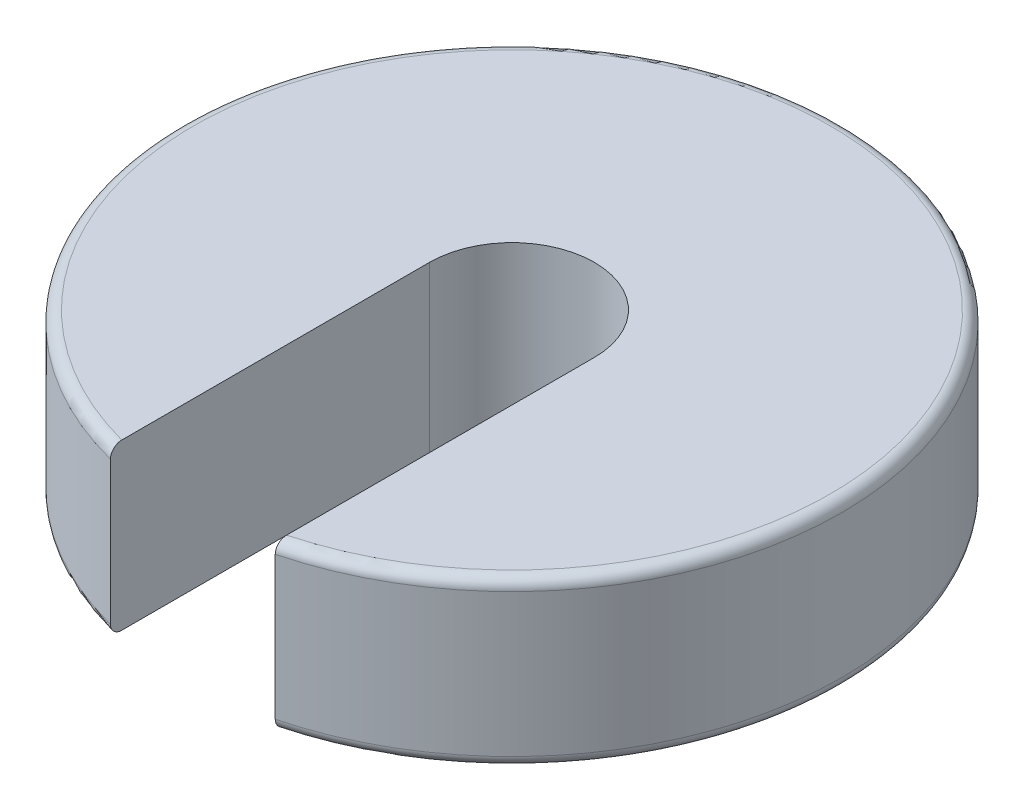
ISO-10303-21;
HEADER;
FILE_DESCRIPTION(('STEP AP214'),'2;1');
FILE_NAME('part.step','',(''),(''),'','','');
FILE_SCHEMA(('AUTOMOTIVE_DESIGN { 1 0 10303 214 1 1 1 1 }'));
ENDSEC;
DATA;
#1=APPLICATION_CONTEXT('core data for automotive mechanical design processes');
#2=APPLICATION_PROTOCOL_DEFINITION('international standard','automotive_design',2000,#1);
#3=PRODUCT_CONTEXT('',#1,'mechanical');
#4=PRODUCT('Part','Part','',(#3));
#5=PRODUCT_RELATED_PRODUCT_CATEGORY('part','',(#4));
#6=PRODUCT_DEFINITION_FORMATION('','',#4);
#7=PRODUCT_DEFINITION_CONTEXT('part definition',#1,'design');
#8=PRODUCT_DEFINITION('design','',#6,#7);
#9=PRODUCT_DEFINITION_SHAPE('','',#8);
#10=(LENGTH_UNIT() NAMED_UNIT(*) SI_UNIT(.MILLI.,.METRE.));
#11=(NAMED_UNIT(*) PLANE_ANGLE_UNIT() SI_UNIT($,.RADIAN.));
#12=(NAMED_UNIT(*) SI_UNIT($,.STERADIAN.) SOLID_ANGLE_UNIT());
#13=UNCERTAINTY_MEASURE_WITH_UNIT(LENGTH_MEASURE(1.E-05),#10,'distance_accuracy_value','');
#14=(GEOMETRIC_REPRESENTATION_CONTEXT(3) GLOBAL_UNCERTAINTY_ASSIGNED_CONTEXT((#13)) GLOBAL_UNIT_ASSIGNED_CONTEXT((#10,
#11,#12)) REPRESENTATION_CONTEXT('',''));
#15=CARTESIAN_POINT('',(0.,0.,0.));
#16=DIRECTION('',(0.,0.,1.));
#17=DIRECTION('',(1.,0.,0.));
#18=AXIS2_PLACEMENT_3D('',#15,#16,#17);
#19=CARTESIAN_POINT('',(0.,3.,0.));
#20=DIRECTION('',(0.,-1.,0.));
#21=DIRECTION('',(0.,0.,-1.));
#22=AXIS2_PLACEMENT_3D('',#19,#20,#21);
#23=CYLINDRICAL_SURFACE('',#22,6.);
#24=DIRECTION('',(0.,-1.,0.));
#25=VECTOR('',#24,1.);
#26=CARTESIAN_POINT('',(1.5,3.,5.80947501931113));
#27=LINE('',#26,#25);
#28=CARTESIAN_POINT('',(1.5,2.8,5.80947501931113));
#29=VERTEX_POINT('',#28);
#30=CARTESIAN_POINT('',(1.5,0.2,5.80947501931113));
#31=VERTEX_POINT('',#30);
#32=EDGE_CURVE('E113',#29,#31,#27,.T.);
#33=ORIENTED_EDGE('',*,*,#32,.T.);
#34=CARTESIAN_POINT('',(0.,0.2,0.));
#35=DIRECTION('',(0.,1.,0.));
#36=DIRECTION('',(0.,0.,1.));
#37=AXIS2_PLACEMENT_3D('',#34,#35,#36);
#38=CIRCLE('',#37,6.);
#39=CARTESIAN_POINT('',(-1.5,0.2,5.80947501931113));
#40=VERTEX_POINT('',#39);
#41=EDGE_CURVE('E126',#31,#40,#38,.T.);
#42=ORIENTED_EDGE('',*,*,#41,.T.);
#43=DIRECTION('',(0.,-1.,0.));
#44=VECTOR('',#43,1.);
#45=CARTESIAN_POINT('',(-1.5,3.,5.80947501931113));
#46=LINE('',#45,#44);
#47=CARTESIAN_POINT('',(-1.5,2.8,5.80947501931113));
#48=VERTEX_POINT('',#47);
#49=EDGE_CURVE('E106',#48,#40,#46,.T.);
#50=ORIENTED_EDGE('',*,*,#49,.F.);
#51=CARTESIAN_POINT('',(0.,2.8,0.));
#52=DIRECTION('',(0.,1.,0.));
#53=DIRECTION('',(0.,0.,1.));
#54=AXIS2_PLACEMENT_3D('',#51,#52,#53);
#55=CIRCLE('',#54,6.);
#56=EDGE_CURVE('E124',#48,#29,#55,.F.);
#57=ORIENTED_EDGE('',*,*,#56,.T.);
#58=EDGE_LOOP('',(#33,#42,#50,#57));
#59=FACE_BOUND('',#58,.T.);
#60=ADVANCED_FACE('F32',(#59),#23,.T.);
#61=CARTESIAN_POINT('',(-1.5,3.,0.));
#62=DIRECTION('',(-1.,0.,0.));
#63=DIRECTION('',(0.,0.,1.));
#64=AXIS2_PLACEMENT_3D('',#61,#62,#63);
#65=PLANE('',#64);
#66=ORIENTED_EDGE('',*,*,#49,.T.);
#67=CARTESIAN_POINT('',(-1.5,0.2,5.80947501931113));
#68=CARTESIAN_POINT('',(-1.5,0.189008933599887,5.80948599438193));
#69=CARTESIAN_POINT('',(-1.5,0.178022759085942,5.80853999530534));
#70=CARTESIAN_POINT('',(-1.5,0.156383030173197,5.80481747789398));
#71=CARTESIAN_POINT('',(-1.5,0.145728954731294,5.80204399567213));
#72=CARTESIAN_POINT('',(-1.5,0.12503596651014,5.79474878908187));
#73=CARTESIAN_POINT('',(-1.5,0.114997163931198,5.79022675258729));
#74=CARTESIAN_POINT('',(-1.5,0.0958072764156644,5.77958394875398));
#75=CARTESIAN_POINT('',(-1.5,0.0866562524932763,5.77346307163861));
#76=CARTESIAN_POINT('',(-1.5,0.0693621122909751,5.75971892031418));
#77=CARTESIAN_POINT('',(-1.5,0.061234092578745,5.75207666920239));
#78=CARTESIAN_POINT('',(-1.5,0.0463297356494129,5.73557081967714));
#79=CARTESIAN_POINT('',(-1.5,0.0395537113474093,5.72670693932218));
#80=CARTESIAN_POINT('',(-1.5,0.0273275343631594,5.70772561407415));
#81=CARTESIAN_POINT('',(-1.5,0.0219237425761824,5.69757833805323));
#82=CARTESIAN_POINT('',(-1.5,0.0128397068005266,5.67654002955768));
#83=CARTESIAN_POINT('',(-1.5,0.00915927739398085,5.66564907724028));
#84=CARTESIAN_POINT('',(-1.5,0.00425876913293413,5.64606081665657));
#85=CARTESIAN_POINT('',(-1.5,0.00266229600699482,5.63745542012178));
#86=CARTESIAN_POINT('',(-1.5,0.000532892070254639,5.62012672365208));
#87=CARTESIAN_POINT('',(-1.5,-1.58426044217717E-06,5.61140361367963));
#88=CARTESIAN_POINT('',(-1.5,0.,5.60267793113258));
#89=B_SPLINE_CURVE_WITH_KNOTS('',3,(#67,#68,#69,#70,#71,#72,#73,#74,#75,#76,#77,#78,#79,#80,#81,
#82,#83,#84,#85,#86,#87,#88),.UNSPECIFIED.,.F.,.F.,(4,2,2,2,2,2,2,2,2,2,4),(0.,
0.0329251665236628,0.0657957698494388,0.0986722434621868,0.131550974972131,0.164868902252238,
0.198194531939894,0.232529275366605,0.26686032384292,0.293054087380499,0.319209703232448),.UNSPECIFIED.);
#90=CARTESIAN_POINT('',(-1.5,0.,5.60267793113258));
#91=VERTEX_POINT('',#90);
#92=EDGE_CURVE('E135',#40,#91,#89,.T.);
#93=ORIENTED_EDGE('',*,*,#92,.T.);
#94=DIRECTION('',(0.,0.,-1.));
#95=VECTOR('',#94,1.);
#96=CARTESIAN_POINT('',(-1.5,0.,0.));
#97=LINE('',#96,#95);
#98=CARTESIAN_POINT('',(-1.5,0.,0.));
#99=VERTEX_POINT('',#98);
#100=EDGE_CURVE('E103',#91,#99,#97,.T.);
#101=ORIENTED_EDGE('',*,*,#100,.T.);
#102=DIRECTION('',(0.,-1.,0.));
#103=VECTOR('',#102,1.);
#104=CARTESIAN_POINT('',(-1.5,3.,0.));
#105=LINE('',#104,#103);
#106=CARTESIAN_POINT('',(-1.5,3.,0.));
#107=VERTEX_POINT('',#106);
#108=EDGE_CURVE('E100',#107,#99,#105,.T.);
#109=ORIENTED_EDGE('',*,*,#108,.F.);
#110=DIRECTION('',(0.,0.,-1.));
#111=VECTOR('',#110,1.);
#112=CARTESIAN_POINT('',(-1.5,3.,0.));
#113=LINE('',#112,#111);
#114=CARTESIAN_POINT('',(-1.5,3.,5.60267793113258));
#115=VERTEX_POINT('',#114);
#116=EDGE_CURVE('E89',#115,#107,#113,.T.);
#117=ORIENTED_EDGE('',*,*,#116,.F.);
#118=CARTESIAN_POINT('',(-1.5,3.,5.60267793113258));
#119=CARTESIAN_POINT('',(-1.5,3.000008259068,5.61461259195377));
#120=CARTESIAN_POINT('',(-1.5,2.99900358818442,5.62654716387195));
#121=CARTESIAN_POINT('',(-1.5,2.99502338959755,5.65008664411374));
#122=CARTESIAN_POINT('',(-1.5,2.99204727710345,5.66169145355401));
#123=CARTESIAN_POINT('',(-1.5,2.9841758121752,5.68424432065016));
#124=CARTESIAN_POINT('',(-1.5,2.97927878031142,5.69519179392379));
#125=CARTESIAN_POINT('',(-1.5,2.96768670880641,5.71608455948175));
#126=CARTESIAN_POINT('',(-1.5,2.9609925539476,5.72603034162668));
#127=CARTESIAN_POINT('',(-1.5,2.94610886079491,5.74444509656023));
#128=CARTESIAN_POINT('',(-1.5,2.93794762975623,5.75293692497845));
#129=CARTESIAN_POINT('',(-1.5,2.92027059776256,5.76837642159457));
#130=CARTESIAN_POINT('',(-1.5,2.91075463924676,5.77532390993778));
#131=CARTESIAN_POINT('',(-1.5,2.89096889922567,5.78723674616235));
#132=CARTESIAN_POINT('',(-1.5,2.88073294440713,5.79225836317973));
#133=CARTESIAN_POINT('',(-1.5,2.85955042525502,5.80045049414683));
#134=CARTESIAN_POINT('',(-1.5,2.8486046319569,5.80362298042498));
#135=CARTESIAN_POINT('',(-1.5,2.83130273700245,5.80703292823925));
#136=CARTESIAN_POINT('',(-1.5,2.82507290748946,5.80794826878768));
#137=CARTESIAN_POINT('',(-1.5,2.8125630916149,5.80916904279337));
#138=CARTESIAN_POINT('',(-1.5,2.80628319299767,5.80947537572529));
#139=CARTESIAN_POINT('',(-1.5,2.80000000000004,5.80947501931131));
#140=B_SPLINE_CURVE_WITH_KNOTS('',3,(#118,#119,#120,#121,#122,#123,#124,#125,#126,#127,#128,
#129,#130,#131,#132,#133,#134,#135,#136,#137,#138,#139),.UNSPECIFIED.,.F.,.F.,(4,2,2,2,2,2,2,2,
2,2,4),(0.,0.0357621225902613,0.0715348580897216,0.107338939088306,0.143125424792021,
0.178283827487581,0.213446322607023,0.247484649879856,0.281486604278595,0.300350141140522,
0.319185796716065),.UNSPECIFIED.);
#141=EDGE_CURVE('E129',#115,#48,#140,.T.);
#142=ORIENTED_EDGE('',*,*,#141,.T.);
#143=EDGE_LOOP('',(#66,#93,#101,#109,#117,#142));
#144=FACE_BOUND('',#143,.T.);
#145=ADVANCED_FACE('F102',(#144),#65,.F.);
#146=CARTESIAN_POINT('',(0.,3.,0.));
#147=DIRECTION('',(0.,-1.,0.));
#148=DIRECTION('',(0.,0.,-1.));
#149=AXIS2_PLACEMENT_3D('',#146,#147,#148);
#150=CYLINDRICAL_SURFACE('',#149,1.5);
#151=CARTESIAN_POINT('',(0.,0.,0.));
#152=DIRECTION('',(0.,-1.,0.));
#153=DIRECTION('',(0.,0.,1.));
#154=AXIS2_PLACEMENT_3D('',#151,#152,#153);
#155=CIRCLE('',#154,1.5);
#156=CARTESIAN_POINT('',(1.5,0.,0.));
#157=VERTEX_POINT('',#156);
#158=EDGE_CURVE('E117',#99,#157,#155,.T.);
#159=ORIENTED_EDGE('',*,*,#158,.T.);
#160=DIRECTION('',(0.,-1.,0.));
#161=VECTOR('',#160,1.);
#162=CARTESIAN_POINT('',(1.5,3.,0.));
#163=LINE('',#162,#161);
#164=CARTESIAN_POINT('',(1.5,3.,0.));
#165=VERTEX_POINT('',#164);
#166=EDGE_CURVE('E107',#165,#157,#163,.T.);
#167=ORIENTED_EDGE('',*,*,#166,.F.);
#168=CARTESIAN_POINT('',(0.,3.,0.));
#169=DIRECTION('',(0.,-1.,0.));
#170=DIRECTION('',(0.,0.,1.));
#171=AXIS2_PLACEMENT_3D('',#168,#169,#170);
#172=CIRCLE('',#171,1.5);
#173=EDGE_CURVE('E93',#107,#165,#172,.T.);
#174=ORIENTED_EDGE('',*,*,#173,.F.);
#175=ORIENTED_EDGE('',*,*,#108,.T.);
#176=EDGE_LOOP('',(#159,#167,#174,#175));
#177=FACE_BOUND('',#176,.T.);
#178=ADVANCED_FACE('F109',(#177),#150,.F.);
#179=CARTESIAN_POINT('',(1.5,3.,0.));
#180=DIRECTION('',(1.,0.,0.));
#181=DIRECTION('',(0.,0.,-1.));
#182=AXIS2_PLACEMENT_3D('',#179,#180,#181);
#183=PLANE('',#182);
#184=DIRECTION('',(0.,0.,1.));
#185=VECTOR('',#184,1.);
#186=CARTESIAN_POINT('',(1.5,0.,0.));
#187=LINE('',#186,#185);
#188=CARTESIAN_POINT('',(1.5,0.,5.60267793113258));
#189=VERTEX_POINT('',#188);
#190=EDGE_CURVE('E97',#157,#189,#187,.T.);
#191=ORIENTED_EDGE('',*,*,#190,.T.);
#192=CARTESIAN_POINT('',(1.5,0.,5.60267793113258));
#193=CARTESIAN_POINT('',(1.5,-8.25906799775553E-06,5.61461259195377));
#194=CARTESIAN_POINT('',(1.5,0.000996411815581027,5.62654716387195));
#195=CARTESIAN_POINT('',(1.5,0.00497661040245406,5.65008664411374));
#196=CARTESIAN_POINT('',(1.5,0.00795272289654698,5.66169145355401));
#197=CARTESIAN_POINT('',(1.5,0.0158241878248029,5.68424432065016));
#198=CARTESIAN_POINT('',(1.5,0.0207212196885815,5.69519179392379));
#199=CARTESIAN_POINT('',(1.5,0.0323132911935883,5.71608455948175));
#200=CARTESIAN_POINT('',(1.5,0.0390074460524036,5.72603034162668));
#201=CARTESIAN_POINT('',(1.5,0.0538911392050858,5.74444509656023));
#202=CARTESIAN_POINT('',(1.5,0.0620523702437712,5.75293692497845));
#203=CARTESIAN_POINT('',(1.5,0.0797294022374391,5.76837642159457));
#204=CARTESIAN_POINT('',(1.5,0.0892453607532377,5.77532390993779));
#205=CARTESIAN_POINT('',(1.5,0.109031100774329,5.78723674616235));
#206=CARTESIAN_POINT('',(1.5,0.119267055592868,5.79225836317973));
#207=CARTESIAN_POINT('',(1.5,0.140449574744978,5.80045049414683));
#208=CARTESIAN_POINT('',(1.5,0.151395368043104,5.80362298042498));
#209=CARTESIAN_POINT('',(1.5,0.168697262997546,5.80703292823925));
#210=CARTESIAN_POINT('',(1.5,0.17492709251054,5.80794826878768));
#211=CARTESIAN_POINT('',(1.5,0.187436908385104,5.80916904279337));
#212=CARTESIAN_POINT('',(1.5,0.193716807002331,5.80947537572529));
#213=CARTESIAN_POINT('',(1.5,0.199999999999964,5.80947501931131));
#214=B_SPLINE_CURVE_WITH_KNOTS('',3,(#192,#193,#194,#195,#196,#197,#198,#199,#200,#201,#202,
#203,#204,#205,#206,#207,#208,#209,#210,#211,#212,#213),.UNSPECIFIED.,.F.,.F.,(4,2,2,2,2,2,2,2,
2,2,4),(0.,0.0357621225902613,0.0715348580897217,0.107338939088307,0.143125424792023,
0.178283827487581,0.213446322607023,0.247484649879857,0.281486604278595,0.300350141140523,
0.319185796716066),.UNSPECIFIED.);
#215=EDGE_CURVE('E41',#189,#31,#214,.T.);
#216=ORIENTED_EDGE('',*,*,#215,.T.);
#217=ORIENTED_EDGE('',*,*,#32,.F.);
#218=CARTESIAN_POINT('',(1.5,2.8,5.80947501931113));
#219=CARTESIAN_POINT('',(1.5,2.81099106640011,5.80948599438193));
#220=CARTESIAN_POINT('',(1.5,2.82197724091406,5.80853999530534));
#221=CARTESIAN_POINT('',(1.5,2.8436169698268,5.80481747789398));
#222=CARTESIAN_POINT('',(1.5,2.85427104526871,5.80204399567213));
#223=CARTESIAN_POINT('',(1.5,2.87496403348986,5.79474878908187));
#224=CARTESIAN_POINT('',(1.5,2.8850028360688,5.79022675258729));
#225=CARTESIAN_POINT('',(1.5,2.90419272358434,5.77958394875398));
#226=CARTESIAN_POINT('',(1.5,2.91334374750672,5.77346307163861));
#227=CARTESIAN_POINT('',(1.5,2.93063788770902,5.75971892031418));
#228=CARTESIAN_POINT('',(1.5,2.93876590742125,5.75207666920239));
#229=CARTESIAN_POINT('',(1.5,2.95367026435059,5.73557081967714));
#230=CARTESIAN_POINT('',(1.5,2.96044628865259,5.72670693932218));
#231=CARTESIAN_POINT('',(1.5,2.97267246563684,5.70772561407415));
#232=CARTESIAN_POINT('',(1.5,2.97807625742382,5.69757833805323));
#233=CARTESIAN_POINT('',(1.5,2.98716029319947,5.67654002955768));
#234=CARTESIAN_POINT('',(1.5,2.99084072260602,5.66564907724028));
#235=CARTESIAN_POINT('',(1.5,2.99574123086707,5.64606081665657));
#236=CARTESIAN_POINT('',(1.5,2.99733770399301,5.63745542012178));
#237=CARTESIAN_POINT('',(1.5,2.99946710792975,5.62012672365208));
#238=CARTESIAN_POINT('',(1.5,3.00000158426044,5.61140361367963));
#239=CARTESIAN_POINT('',(1.5,3.,5.60267793113258));
#240=B_SPLINE_CURVE_WITH_KNOTS('',3,(#218,#219,#220,#221,#222,#223,#224,#225,#226,#227,#228,
#229,#230,#231,#232,#233,#234,#235,#236,#237,#238,#239),.UNSPECIFIED.,.F.,.F.,(4,2,2,2,2,2,2,2,
2,2,4),(0.,0.0329251665236628,0.0657957698494388,0.0986722434621866,0.131550974972131,
0.164868902252238,0.198194531939894,0.232529275366605,0.26686032384292,0.293054087380499,
0.319209703232448),.UNSPECIFIED.);
#241=CARTESIAN_POINT('',(1.5,3.,5.60267793113258));
#242=VERTEX_POINT('',#241);
#243=EDGE_CURVE('E48',#29,#242,#240,.T.);
#244=ORIENTED_EDGE('',*,*,#243,.T.);
#245=DIRECTION('',(0.,0.,1.));
#246=VECTOR('',#245,1.);
#247=CARTESIAN_POINT('',(1.5,3.,0.));
#248=LINE('',#247,#246);
#249=EDGE_CURVE('E111',#165,#242,#248,.T.);
#250=ORIENTED_EDGE('',*,*,#249,.F.);
#251=ORIENTED_EDGE('',*,*,#166,.T.);
#252=EDGE_LOOP('',(#191,#216,#217,#244,#250,#251));
#253=FACE_BOUND('',#252,.T.);
#254=ADVANCED_FACE('F161',(#253),#183,.F.);
#255=CARTESIAN_POINT('',(0.,3.,0.));
#256=DIRECTION('',(0.,1.,0.));
#257=DIRECTION('',(0.,0.,1.));
#258=AXIS2_PLACEMENT_3D('',#255,#256,#257);
#259=PLANE('',#258);
#260=ORIENTED_EDGE('',*,*,#249,.T.);
#261=CARTESIAN_POINT('',(0.,3.,0.));
#262=DIRECTION('',(0.,1.,0.));
#263=DIRECTION('',(0.,0.,1.));
#264=AXIS2_PLACEMENT_3D('',#261,#262,#263);
#265=CIRCLE('',#264,5.8);
#266=EDGE_CURVE('E11',#242,#115,#265,.T.);
#267=ORIENTED_EDGE('',*,*,#266,.T.);
#268=ORIENTED_EDGE('',*,*,#116,.T.);
#269=ORIENTED_EDGE('',*,*,#173,.T.);
#270=EDGE_LOOP('',(#260,#267,#268,#269));
#271=FACE_BOUND('',#270,.T.);
#272=ADVANCED_FACE('F91',(#271),#259,.T.);
#273=CARTESIAN_POINT('',(0.,0.,0.));
#274=DIRECTION('',(0.,1.,0.));
#275=DIRECTION('',(0.,0.,1.));
#276=AXIS2_PLACEMENT_3D('',#273,#274,#275);
#277=PLANE('',#276);
#278=ORIENTED_EDGE('',*,*,#100,.F.);
#279=CARTESIAN_POINT('',(0.,0.,0.));
#280=DIRECTION('',(0.,1.,0.));
#281=DIRECTION('',(0.,0.,1.));
#282=AXIS2_PLACEMENT_3D('',#279,#280,#281);
#283=CIRCLE('',#282,5.8);
#284=EDGE_CURVE('E56',#91,#189,#283,.F.);
#285=ORIENTED_EDGE('',*,*,#284,.T.);
#286=ORIENTED_EDGE('',*,*,#190,.F.);
#287=ORIENTED_EDGE('',*,*,#158,.F.);
#288=EDGE_LOOP('',(#278,#285,#286,#287));
#289=FACE_BOUND('',#288,.T.);
#290=ADVANCED_FACE('F151',(#289),#277,.F.);
#291=CARTESIAN_POINT('',(0.,0.2,0.));
#292=DIRECTION('',(0.,1.,0.));
#293=DIRECTION('',(0.,0.,1.));
#294=AXIS2_PLACEMENT_3D('',#291,#292,#293);
#295=TOROIDAL_SURFACE('',#294,5.8,0.2);
#296=ORIENTED_EDGE('',*,*,#215,.F.);
#297=ORIENTED_EDGE('',*,*,#284,.F.);
#298=ORIENTED_EDGE('',*,*,#92,.F.);
#299=ORIENTED_EDGE('',*,*,#41,.F.);
#300=EDGE_LOOP('',(#296,#297,#298,#299));
#301=FACE_BOUND('',#300,.T.);
#302=ADVANCED_FACE('F148',(#301),#295,.T.);
#303=CARTESIAN_POINT('',(0.,2.8,0.));
#304=DIRECTION('',(0.,1.,0.));
#305=DIRECTION('',(0.,0.,1.));
#306=AXIS2_PLACEMENT_3D('',#303,#304,#305);
#307=TOROIDAL_SURFACE('',#306,5.8,0.2);
#308=ORIENTED_EDGE('',*,*,#243,.F.);
#309=ORIENTED_EDGE('',*,*,#56,.F.);
#310=ORIENTED_EDGE('',*,*,#141,.F.);
#311=ORIENTED_EDGE('',*,*,#266,.F.);
#312=EDGE_LOOP('',(#308,#309,#310,#311));
#313=FACE_BOUND('',#312,.T.);
#314=ADVANCED_FACE('F34',(#313),#307,.T.);
#315=CLOSED_SHELL('',(#60,#145,#178,#254,#272,#290,#302,#314));
#316=MANIFOLD_SOLID_BREP('B2',#315);
#317=ADVANCED_BREP_SHAPE_REPRESENTATION('',(#18,#316),#14);
#318=SHAPE_DEFINITION_REPRESENTATION(#9,#317);
ENDSEC;
END-ISO-10303-21;
